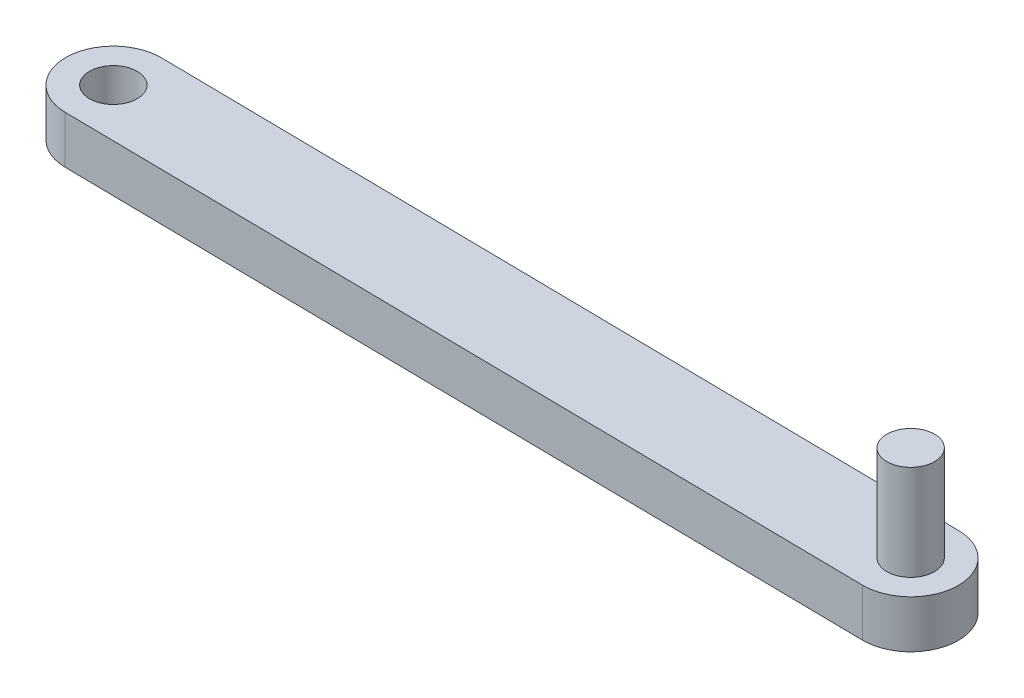
ISO-10303-21;
HEADER;
FILE_DESCRIPTION(('STEP AP214'),'2;1');
FILE_NAME('part.step','',(''),(''),'','','');
FILE_SCHEMA(('AUTOMOTIVE_DESIGN { 1 0 10303 214 1 1 1 1 }'));
ENDSEC;
DATA;
#1=APPLICATION_CONTEXT('core data for automotive mechanical design processes');
#2=APPLICATION_PROTOCOL_DEFINITION('international standard','automotive_design',2000,#1);
#3=PRODUCT_CONTEXT('',#1,'mechanical');
#4=PRODUCT('Part','Part','',(#3));
#5=PRODUCT_RELATED_PRODUCT_CATEGORY('part','',(#4));
#6=PRODUCT_DEFINITION_FORMATION('','',#4);
#7=PRODUCT_DEFINITION_CONTEXT('part definition',#1,'design');
#8=PRODUCT_DEFINITION('design','',#6,#7);
#9=PRODUCT_DEFINITION_SHAPE('','',#8);
#10=(LENGTH_UNIT() NAMED_UNIT(*) SI_UNIT(.MILLI.,.METRE.));
#11=(NAMED_UNIT(*) PLANE_ANGLE_UNIT() SI_UNIT($,.RADIAN.));
#12=(NAMED_UNIT(*) SI_UNIT($,.STERADIAN.) SOLID_ANGLE_UNIT());
#13=UNCERTAINTY_MEASURE_WITH_UNIT(LENGTH_MEASURE(1.E-05),#10,'distance_accuracy_value','');
#14=(GEOMETRIC_REPRESENTATION_CONTEXT(3) GLOBAL_UNCERTAINTY_ASSIGNED_CONTEXT((#13)) GLOBAL_UNIT_ASSIGNED_CONTEXT((#10,
#11,#12)) REPRESENTATION_CONTEXT('',''));
#15=CARTESIAN_POINT('',(0.,0.,0.));
#16=DIRECTION('',(0.,0.,1.));
#17=DIRECTION('',(1.,0.,0.));
#18=AXIS2_PLACEMENT_3D('',#15,#16,#17);
#19=CARTESIAN_POINT('',(-14.5716160355899,5.,-1.70714880270089));
#20=DIRECTION('',(0.,1.,0.));
#21=DIRECTION('',(0.,0.,1.));
#22=AXIS2_PLACEMENT_3D('',#19,#20,#21);
#23=PLANE('',#22);
#24=CARTESIAN_POINT('',(70.2283839644101,5.,-0.567801393871704));
#25=DIRECTION('',(0.,1.,0.));
#26=DIRECTION('',(0.,0.,1.));
#27=AXIS2_PLACEMENT_3D('',#24,#25,#26);
#28=CIRCLE('',#27,2.5);
#29=CARTESIAN_POINT('',(70.2283839644101,5.,1.93219860612829));
#30=VERTEX_POINT('',#29);
#31=EDGE_CURVE('E118',#30,#30,#28,.T.);
#32=ORIENTED_EDGE('',*,*,#31,.F.);
#33=EDGE_LOOP('',(#32));
#34=FACE_BOUND('',#33,.T.);
#35=CARTESIAN_POINT('',(-14.5716160355899,5.,-1.70714880270089));
#36=DIRECTION('',(0.,1.,0.));
#37=DIRECTION('',(0.,0.,1.));
#38=AXIS2_PLACEMENT_3D('',#35,#36,#37);
#39=CIRCLE('',#38,5.);
#40=CARTESIAN_POINT('',(-14.5044435953561,5.,-6.70669756866698));
#41=VERTEX_POINT('',#40);
#42=CARTESIAN_POINT('',(-14.6387884758236,5.,3.2923999632652));
#43=VERTEX_POINT('',#42);
#44=EDGE_CURVE('E85',#41,#43,#39,.T.);
#45=ORIENTED_EDGE('',*,*,#44,.T.);
#46=DIRECTION('',(0.999909753193218,0.,0.013434488046742));
#47=VECTOR('',#46,1.);
#48=CARTESIAN_POINT('',(-14.6387884758236,5.,3.2923999632652));
#49=LINE('',#48,#47);
#50=CARTESIAN_POINT('',(70.1612115241764,5.,4.43174737209439));
#51=VERTEX_POINT('',#50);
#52=EDGE_CURVE('E80',#43,#51,#49,.T.);
#53=ORIENTED_EDGE('',*,*,#52,.T.);
#54=CARTESIAN_POINT('',(70.2283839644101,5.,-0.567801393871705));
#55=DIRECTION('',(0.,1.,0.));
#56=DIRECTION('',(0.,0.,1.));
#57=AXIS2_PLACEMENT_3D('',#54,#55,#56);
#58=CIRCLE('',#57,5.);
#59=CARTESIAN_POINT('',(70.2955564046438,5.,-5.5673501598378));
#60=VERTEX_POINT('',#59);
#61=EDGE_CURVE('E83',#51,#60,#58,.T.);
#62=ORIENTED_EDGE('',*,*,#61,.T.);
#63=DIRECTION('',(-0.999909753193218,0.,-0.0134344880467419));
#64=VECTOR('',#63,1.);
#65=CARTESIAN_POINT('',(-14.5044435953561,5.,-6.70669756866698));
#66=LINE('',#65,#64);
#67=EDGE_CURVE('E50',#60,#41,#66,.T.);
#68=ORIENTED_EDGE('',*,*,#67,.T.);
#69=EDGE_LOOP('',(#45,#53,#62,#68));
#70=FACE_BOUND('',#69,.T.);
#71=CARTESIAN_POINT('',(-14.5716160355899,5.,-1.70714880270089));
#72=DIRECTION('',(0.,1.,0.));
#73=DIRECTION('',(0.,0.,1.));
#74=AXIS2_PLACEMENT_3D('',#71,#72,#73);
#75=CIRCLE('',#74,2.5);
#76=CARTESIAN_POINT('',(-14.5716160355899,5.,0.792851197299112));
#77=VERTEX_POINT('',#76);
#78=EDGE_CURVE('E100',#77,#77,#75,.T.);
#79=ORIENTED_EDGE('',*,*,#78,.F.);
#80=EDGE_LOOP('',(#79));
#81=FACE_BOUND('',#80,.T.);
#82=ADVANCED_FACE('F33',(#34,#70,#81),#23,.T.);
#83=CARTESIAN_POINT('',(-14.5716160355899,0.,-1.70714880270089));
#84=DIRECTION('',(0.,1.,0.));
#85=DIRECTION('',(0.,0.,1.));
#86=AXIS2_PLACEMENT_3D('',#83,#84,#85);
#87=PLANE('',#86);
#88=CARTESIAN_POINT('',(-14.5716160355899,0.,-1.70714880270089));
#89=DIRECTION('',(0.,1.,0.));
#90=DIRECTION('',(0.,0.,1.));
#91=AXIS2_PLACEMENT_3D('',#88,#89,#90);
#92=CIRCLE('',#91,5.);
#93=CARTESIAN_POINT('',(-14.5044435953561,0.,-6.70669756866698));
#94=VERTEX_POINT('',#93);
#95=CARTESIAN_POINT('',(-14.6387884758236,0.,3.2923999632652));
#96=VERTEX_POINT('',#95);
#97=EDGE_CURVE('E97',#94,#96,#92,.T.);
#98=ORIENTED_EDGE('',*,*,#97,.F.);
#99=DIRECTION('',(-0.999909753193218,0.,-0.0134344880467419));
#100=VECTOR('',#99,1.);
#101=CARTESIAN_POINT('',(-14.5044435953561,0.,-6.70669756866698));
#102=LINE('',#101,#100);
#103=CARTESIAN_POINT('',(70.2955564046438,0.,-5.5673501598378));
#104=VERTEX_POINT('',#103);
#105=EDGE_CURVE('E73',#104,#94,#102,.T.);
#106=ORIENTED_EDGE('',*,*,#105,.F.);
#107=CARTESIAN_POINT('',(70.2283839644101,0.,-0.567801393871705));
#108=DIRECTION('',(0.,1.,0.));
#109=DIRECTION('',(0.,0.,1.));
#110=AXIS2_PLACEMENT_3D('',#107,#108,#109);
#111=CIRCLE('',#110,5.);
#112=CARTESIAN_POINT('',(70.1612115241764,0.,4.43174737209439));
#113=VERTEX_POINT('',#112);
#114=EDGE_CURVE('E67',#113,#104,#111,.T.);
#115=ORIENTED_EDGE('',*,*,#114,.F.);
#116=DIRECTION('',(0.999909753193218,0.,0.013434488046742));
#117=VECTOR('',#116,1.);
#118=CARTESIAN_POINT('',(-14.6387884758236,0.,3.2923999632652));
#119=LINE('',#118,#117);
#120=EDGE_CURVE('E89',#96,#113,#119,.T.);
#121=ORIENTED_EDGE('',*,*,#120,.F.);
#122=EDGE_LOOP('',(#98,#106,#115,#121));
#123=FACE_BOUND('',#122,.T.);
#124=CARTESIAN_POINT('',(-14.5716160355899,0.,-1.70714880270089));
#125=DIRECTION('',(0.,1.,0.));
#126=DIRECTION('',(0.,0.,1.));
#127=AXIS2_PLACEMENT_3D('',#124,#125,#126);
#128=CIRCLE('',#127,2.5);
#129=CARTESIAN_POINT('',(-14.5716160355899,0.,0.792851197299112));
#130=VERTEX_POINT('',#129);
#131=EDGE_CURVE('E112',#130,#130,#128,.T.);
#132=ORIENTED_EDGE('',*,*,#131,.T.);
#133=EDGE_LOOP('',(#132));
#134=FACE_BOUND('',#133,.T.);
#135=ADVANCED_FACE('F108',(#123,#134),#87,.F.);
#136=CARTESIAN_POINT('',(-14.5716160355899,5.,-1.70714880270089));
#137=DIRECTION('',(0.,-1.,0.));
#138=DIRECTION('',(0.,0.,-1.));
#139=AXIS2_PLACEMENT_3D('',#136,#137,#138);
#140=CYLINDRICAL_SURFACE('',#139,5.);
#141=ORIENTED_EDGE('',*,*,#97,.T.);
#142=DIRECTION('',(0.,-1.,0.));
#143=VECTOR('',#142,1.);
#144=CARTESIAN_POINT('',(-14.6387884758236,5.,3.2923999632652));
#145=LINE('',#144,#143);
#146=EDGE_CURVE('E11',#43,#96,#145,.T.);
#147=ORIENTED_EDGE('',*,*,#146,.F.);
#148=ORIENTED_EDGE('',*,*,#44,.F.);
#149=DIRECTION('',(0.,-1.,0.));
#150=VECTOR('',#149,1.);
#151=CARTESIAN_POINT('',(-14.5044435953561,5.,-6.70669756866698));
#152=LINE('',#151,#150);
#153=EDGE_CURVE('E93',#41,#94,#152,.T.);
#154=ORIENTED_EDGE('',*,*,#153,.T.);
#155=EDGE_LOOP('',(#141,#147,#148,#154));
#156=FACE_BOUND('',#155,.T.);
#157=ADVANCED_FACE('F35',(#156),#140,.T.);
#158=CARTESIAN_POINT('',(-14.6387884758236,5.,3.2923999632652));
#159=DIRECTION('',(0.013434488046742,0.,-0.999909753193218));
#160=DIRECTION('',(-0.999909753193218,0.,-0.013434488046742));
#161=AXIS2_PLACEMENT_3D('',#158,#159,#160);
#162=PLANE('',#161);
#163=ORIENTED_EDGE('',*,*,#120,.T.);
#164=DIRECTION('',(0.,-1.,0.));
#165=VECTOR('',#164,1.);
#166=CARTESIAN_POINT('',(70.1612115241764,5.,4.43174737209439));
#167=LINE('',#166,#165);
#168=EDGE_CURVE('E42',#51,#113,#167,.T.);
#169=ORIENTED_EDGE('',*,*,#168,.F.);
#170=ORIENTED_EDGE('',*,*,#52,.F.);
#171=ORIENTED_EDGE('',*,*,#146,.T.);
#172=EDGE_LOOP('',(#163,#169,#170,#171));
#173=FACE_BOUND('',#172,.T.);
#174=ADVANCED_FACE('F88',(#173),#162,.F.);
#175=CARTESIAN_POINT('',(70.2283839644101,5.,-0.567801393871705));
#176=DIRECTION('',(0.,-1.,0.));
#177=DIRECTION('',(0.,0.,-1.));
#178=AXIS2_PLACEMENT_3D('',#175,#176,#177);
#179=CYLINDRICAL_SURFACE('',#178,5.);
#180=ORIENTED_EDGE('',*,*,#114,.T.);
#181=DIRECTION('',(0.,-1.,0.));
#182=VECTOR('',#181,1.);
#183=CARTESIAN_POINT('',(70.2955564046438,5.,-5.5673501598378));
#184=LINE('',#183,#182);
#185=EDGE_CURVE('E90',#60,#104,#184,.T.);
#186=ORIENTED_EDGE('',*,*,#185,.F.);
#187=ORIENTED_EDGE('',*,*,#61,.F.);
#188=ORIENTED_EDGE('',*,*,#168,.T.);
#189=EDGE_LOOP('',(#180,#186,#187,#188));
#190=FACE_BOUND('',#189,.T.);
#191=ADVANCED_FACE('F91',(#190),#179,.T.);
#192=CARTESIAN_POINT('',(-14.5044435953561,5.,-6.70669756866698));
#193=DIRECTION('',(-0.0134344880467419,0.,0.999909753193218));
#194=DIRECTION('',(0.999909753193218,0.,0.0134344880467419));
#195=AXIS2_PLACEMENT_3D('',#192,#193,#194);
#196=PLANE('',#195);
#197=ORIENTED_EDGE('',*,*,#105,.T.);
#198=ORIENTED_EDGE('',*,*,#153,.F.);
#199=ORIENTED_EDGE('',*,*,#67,.F.);
#200=ORIENTED_EDGE('',*,*,#185,.T.);
#201=EDGE_LOOP('',(#197,#198,#199,#200));
#202=FACE_BOUND('',#201,.T.);
#203=ADVANCED_FACE('F105',(#202),#196,.F.);
#204=CARTESIAN_POINT('',(-14.5716160355899,5.,-1.70714880270089));
#205=DIRECTION('',(0.,-1.,0.));
#206=DIRECTION('',(0.,0.,-1.));
#207=AXIS2_PLACEMENT_3D('',#204,#205,#206);
#208=CYLINDRICAL_SURFACE('',#207,2.5);
#209=ORIENTED_EDGE('',*,*,#78,.T.);
#210=EDGE_LOOP('',(#209));
#211=FACE_BOUND('',#210,.T.);
#212=ORIENTED_EDGE('',*,*,#131,.F.);
#213=EDGE_LOOP('',(#212));
#214=FACE_BOUND('',#213,.T.);
#215=ADVANCED_FACE('F129',(#211,#214),#208,.F.);
#216=CARTESIAN_POINT('',(70.2283839644101,15.,-0.567801393871704));
#217=DIRECTION('',(0.,-1.,0.));
#218=DIRECTION('',(0.,0.,-1.));
#219=AXIS2_PLACEMENT_3D('',#216,#217,#218);
#220=CYLINDRICAL_SURFACE('',#219,2.5);
#221=CARTESIAN_POINT('',(70.2283839644101,15.,-0.567801393871704));
#222=DIRECTION('',(0.,1.,0.));
#223=DIRECTION('',(0.,0.,1.));
#224=AXIS2_PLACEMENT_3D('',#221,#222,#223);
#225=CIRCLE('',#224,2.5);
#226=CARTESIAN_POINT('',(70.2283839644101,15.,1.93219860612829));
#227=VERTEX_POINT('',#226);
#228=EDGE_CURVE('E115',#227,#227,#225,.T.);
#229=ORIENTED_EDGE('',*,*,#228,.F.);
#230=EDGE_LOOP('',(#229));
#231=FACE_BOUND('',#230,.T.);
#232=ORIENTED_EDGE('',*,*,#31,.T.);
#233=EDGE_LOOP('',(#232));
#234=FACE_BOUND('',#233,.T.);
#235=ADVANCED_FACE('F126',(#231,#234),#220,.T.);
#236=CARTESIAN_POINT('',(70.2283839644101,15.,-0.567801393871704));
#237=DIRECTION('',(0.,1.,0.));
#238=DIRECTION('',(0.,0.,1.));
#239=AXIS2_PLACEMENT_3D('',#236,#237,#238);
#240=PLANE('',#239);
#241=ORIENTED_EDGE('',*,*,#228,.T.);
#242=EDGE_LOOP('',(#241));
#243=FACE_BOUND('',#242,.T.);
#244=ADVANCED_FACE('F124',(#243),#240,.T.);
#245=CLOSED_SHELL('',(#82,#135,#157,#174,#191,#203,#215,#235,#244));
#246=MANIFOLD_SOLID_BREP('B2',#245);
#247=ADVANCED_BREP_SHAPE_REPRESENTATION('',(#18,#246),#14);
#248=SHAPE_DEFINITION_REPRESENTATION(#9,#247);
ENDSEC;
END-ISO-10303-21;
